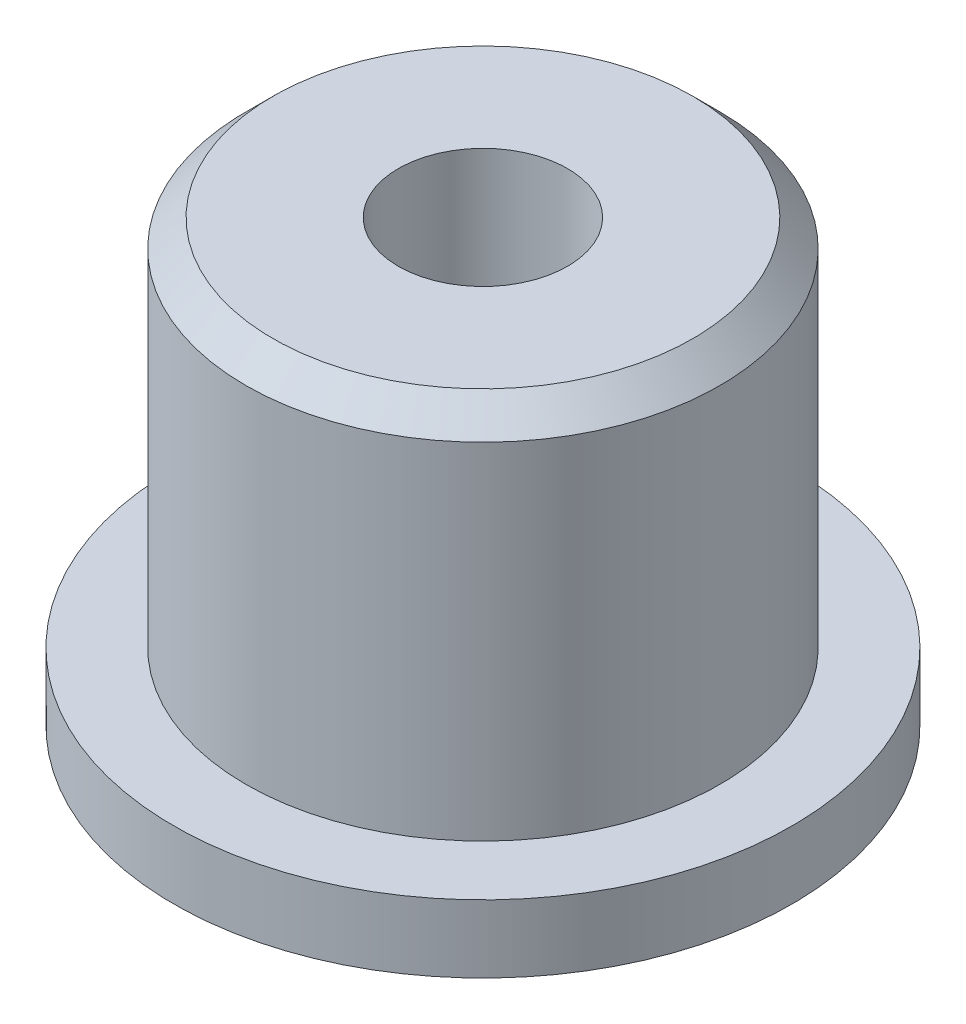
ISO-10303-21;
HEADER;
FILE_DESCRIPTION(('STEP AP214'),'2;1');
FILE_NAME('part.step','',(''),(''),'','','');
FILE_SCHEMA(('AUTOMOTIVE_DESIGN { 1 0 10303 214 1 1 1 1 }'));
ENDSEC;
DATA;
#1=APPLICATION_CONTEXT('core data for automotive mechanical design processes');
#2=APPLICATION_PROTOCOL_DEFINITION('international standard','automotive_design',2000,#1);
#3=PRODUCT_CONTEXT('',#1,'mechanical');
#4=PRODUCT('Part','Part','',(#3));
#5=PRODUCT_RELATED_PRODUCT_CATEGORY('part','',(#4));
#6=PRODUCT_DEFINITION_FORMATION('','',#4);
#7=PRODUCT_DEFINITION_CONTEXT('part definition',#1,'design');
#8=PRODUCT_DEFINITION('design','',#6,#7);
#9=PRODUCT_DEFINITION_SHAPE('','',#8);
#10=(LENGTH_UNIT() NAMED_UNIT(*) SI_UNIT(.MILLI.,.METRE.));
#11=(NAMED_UNIT(*) PLANE_ANGLE_UNIT() SI_UNIT($,.RADIAN.));
#12=(NAMED_UNIT(*) SI_UNIT($,.STERADIAN.) SOLID_ANGLE_UNIT());
#13=UNCERTAINTY_MEASURE_WITH_UNIT(LENGTH_MEASURE(1.E-05),#10,'distance_accuracy_value','');
#14=(GEOMETRIC_REPRESENTATION_CONTEXT(3) GLOBAL_UNCERTAINTY_ASSIGNED_CONTEXT((#13)) GLOBAL_UNIT_ASSIGNED_CONTEXT((#10,
#11,#12)) REPRESENTATION_CONTEXT('',''));
#15=CARTESIAN_POINT('',(0.,0.,0.));
#16=DIRECTION('',(0.,0.,1.));
#17=DIRECTION('',(1.,0.,0.));
#18=AXIS2_PLACEMENT_3D('',#15,#16,#17);
#19=CARTESIAN_POINT('',(0.,4.,0.));
#20=DIRECTION('',(0.,1.,0.));
#21=DIRECTION('',(0.,0.,1.));
#22=AXIS2_PLACEMENT_3D('',#19,#20,#21);
#23=CYLINDRICAL_SURFACE('',#22,14.);
#24=CARTESIAN_POINT('',(0.,4.,0.));
#25=DIRECTION('',(0.,1.,0.));
#26=DIRECTION('',(0.,0.,1.));
#27=AXIS2_PLACEMENT_3D('',#24,#25,#26);
#28=CIRCLE('',#27,14.);
#29=CARTESIAN_POINT('',(0.,4.,14.));
#30=VERTEX_POINT('',#29);
#31=EDGE_CURVE('E42',#30,#30,#28,.T.);
#32=ORIENTED_EDGE('',*,*,#31,.T.);
#33=EDGE_LOOP('',(#32));
#34=FACE_BOUND('',#33,.T.);
#35=CARTESIAN_POINT('',(0.,24.4,0.));
#36=DIRECTION('',(0.,-1.,0.));
#37=DIRECTION('',(0.,0.,-1.));
#38=AXIS2_PLACEMENT_3D('',#35,#36,#37);
#39=CIRCLE('',#38,13.9999999999999);
#40=CARTESIAN_POINT('',(0.,24.4,-13.9999999999998));
#41=VERTEX_POINT('',#40);
#42=EDGE_CURVE('E52',#41,#41,#39,.T.);
#43=ORIENTED_EDGE('',*,*,#42,.T.);
#44=EDGE_LOOP('',(#43));
#45=FACE_BOUND('',#44,.T.);
#46=ADVANCED_FACE('F31',(#34,#45),#23,.T.);
#47=CARTESIAN_POINT('',(0.,26.,0.));
#48=DIRECTION('',(0.,1.,0.));
#49=DIRECTION('',(0.,0.,1.));
#50=AXIS2_PLACEMENT_3D('',#47,#48,#49);
#51=PLANE('',#50);
#52=CARTESIAN_POINT('',(0.,26.,0.));
#53=DIRECTION('',(0.,1.,0.));
#54=DIRECTION('',(0.,0.,1.));
#55=AXIS2_PLACEMENT_3D('',#52,#53,#54);
#56=CIRCLE('',#55,5.);
#57=CARTESIAN_POINT('',(0.,26.,5.));
#58=VERTEX_POINT('',#57);
#59=EDGE_CURVE('E49',#58,#58,#56,.T.);
#60=ORIENTED_EDGE('',*,*,#59,.F.);
#61=EDGE_LOOP('',(#60));
#62=FACE_BOUND('',#61,.T.);
#63=CARTESIAN_POINT('',(0.,26.,0.));
#64=DIRECTION('',(0.,-1.,0.));
#65=DIRECTION('',(0.,0.,-1.));
#66=AXIS2_PLACEMENT_3D('',#63,#64,#65);
#67=CIRCLE('',#66,12.3999999999999);
#68=CARTESIAN_POINT('',(0.,26.0000000000001,-12.3999999999998));
#69=VERTEX_POINT('',#68);
#70=EDGE_CURVE('E57',#69,#69,#67,.T.);
#71=ORIENTED_EDGE('',*,*,#70,.F.);
#72=EDGE_LOOP('',(#71));
#73=FACE_BOUND('',#72,.T.);
#74=ADVANCED_FACE('F64',(#62,#73),#51,.T.);
#75=CARTESIAN_POINT('',(0.,26.,0.));
#76=DIRECTION('',(0.,-1.,0.));
#77=DIRECTION('',(0.,0.,-1.));
#78=AXIS2_PLACEMENT_3D('',#75,#76,#77);
#79=CYLINDRICAL_SURFACE('',#78,18.25);
#80=CARTESIAN_POINT('',(0.,0.,0.));
#81=DIRECTION('',(0.,1.,0.));
#82=DIRECTION('',(0.,0.,1.));
#83=AXIS2_PLACEMENT_3D('',#80,#81,#82);
#84=CIRCLE('',#83,18.25);
#85=CARTESIAN_POINT('',(0.,0.,-18.25));
#86=VERTEX_POINT('',#85);
#87=EDGE_CURVE('E10',#86,#86,#84,.T.);
#88=CARTESIAN_POINT('',(0.,4.,0.));
#89=DIRECTION('',(0.,1.,0.));
#90=DIRECTION('',(0.,0.,1.));
#91=AXIS2_PLACEMENT_3D('',#88,#89,#90);
#92=CIRCLE('',#91,18.25);
#93=CARTESIAN_POINT('',(0.,4.,-18.25));
#94=VERTEX_POINT('',#93);
#95=EDGE_CURVE('E38',#94,#94,#92,.T.);
#96=CARTESIAN_POINT('',(0.,0.,-18.25));
#97=CARTESIAN_POINT('',(0.,0.0416666666666667,-18.25));
#98=CARTESIAN_POINT('',(0.,0.0833333333333334,-18.25));
#99=CARTESIAN_POINT('',(0.,0.166666666666667,-18.25));
#100=CARTESIAN_POINT('',(0.,0.208333333333334,-18.25));
#101=CARTESIAN_POINT('',(0.,0.291666666666667,-18.25));
#102=CARTESIAN_POINT('',(0.,0.333333333333334,-18.25));
#103=CARTESIAN_POINT('',(0.,0.416666666666667,-18.25));
#104=CARTESIAN_POINT('',(0.,0.458333333333334,-18.25));
#105=CARTESIAN_POINT('',(0.,0.541666666666667,-18.25));
#106=CARTESIAN_POINT('',(0.,0.583333333333334,-18.25));
#107=CARTESIAN_POINT('',(0.,0.666666666666667,-18.25));
#108=CARTESIAN_POINT('',(0.,0.708333333333334,-18.25));
#109=CARTESIAN_POINT('',(0.,0.791666666666667,-18.25));
#110=CARTESIAN_POINT('',(0.,0.833333333333334,-18.25));
#111=CARTESIAN_POINT('',(0.,0.916666666666668,-18.25));
#112=CARTESIAN_POINT('',(0.,0.958333333333334,-18.25));
#113=CARTESIAN_POINT('',(0.,1.04166666666667,-18.25));
#114=CARTESIAN_POINT('',(0.,1.08333333333333,-18.25));
#115=CARTESIAN_POINT('',(0.,1.16666666666666,-18.25));
#116=CARTESIAN_POINT('',(0.,1.20833333333333,-18.25));
#117=CARTESIAN_POINT('',(0.,1.29166666666666,-18.25));
#118=CARTESIAN_POINT('',(0.,1.33333333333333,-18.25));
#119=CARTESIAN_POINT('',(0.,1.41666666666666,-18.25));
#120=CARTESIAN_POINT('',(0.,1.45833333333333,-18.25));
#121=CARTESIAN_POINT('',(0.,1.54166666666666,-18.25));
#122=CARTESIAN_POINT('',(0.,1.58333333333333,-18.25));
#123=CARTESIAN_POINT('',(0.,1.66666666666666,-18.25));
#124=CARTESIAN_POINT('',(0.,1.70833333333333,-18.25));
#125=CARTESIAN_POINT('',(0.,1.79166666666666,-18.25));
#126=CARTESIAN_POINT('',(0.,1.83333333333333,-18.25));
#127=CARTESIAN_POINT('',(0.,1.91666666666666,-18.25));
#128=CARTESIAN_POINT('',(0.,1.95833333333333,-18.25));
#129=CARTESIAN_POINT('',(0.,2.04166666666667,-18.25));
#130=CARTESIAN_POINT('',(0.,2.08333333333333,-18.25));
#131=CARTESIAN_POINT('',(0.,2.16666666666667,-18.25));
#132=CARTESIAN_POINT('',(0.,2.20833333333333,-18.25));
#133=CARTESIAN_POINT('',(0.,2.29166666666667,-18.25));
#134=CARTESIAN_POINT('',(0.,2.33333333333333,-18.25));
#135=CARTESIAN_POINT('',(0.,2.41666666666667,-18.25));
#136=CARTESIAN_POINT('',(0.,2.45833333333333,-18.25));
#137=CARTESIAN_POINT('',(0.,2.54166666666667,-18.25));
#138=CARTESIAN_POINT('',(0.,2.58333333333333,-18.25));
#139=CARTESIAN_POINT('',(0.,2.66666666666667,-18.25));
#140=CARTESIAN_POINT('',(0.,2.70833333333333,-18.25));
#141=CARTESIAN_POINT('',(0.,2.79166666666666,-18.25));
#142=CARTESIAN_POINT('',(0.,2.83333333333333,-18.25));
#143=CARTESIAN_POINT('',(0.,2.91666666666666,-18.25));
#144=CARTESIAN_POINT('',(0.,2.95833333333333,-18.25));
#145=CARTESIAN_POINT('',(0.,3.04166666666666,-18.25));
#146=CARTESIAN_POINT('',(0.,3.08333333333333,-18.25));
#147=CARTESIAN_POINT('',(0.,3.16666666666666,-18.25));
#148=CARTESIAN_POINT('',(0.,3.20833333333333,-18.25));
#149=CARTESIAN_POINT('',(0.,3.29166666666666,-18.25));
#150=CARTESIAN_POINT('',(0.,3.33333333333333,-18.25));
#151=CARTESIAN_POINT('',(0.,3.41666666666666,-18.25));
#152=CARTESIAN_POINT('',(0.,3.45833333333333,-18.25));
#153=CARTESIAN_POINT('',(0.,3.54166666666666,-18.25));
#154=CARTESIAN_POINT('',(0.,3.58333333333333,-18.25));
#155=CARTESIAN_POINT('',(0.,3.66666666666666,-18.25));
#156=CARTESIAN_POINT('',(0.,3.70833333333333,-18.25));
#157=CARTESIAN_POINT('',(0.,3.79166666666666,-18.25));
#158=CARTESIAN_POINT('',(0.,3.83333333333333,-18.25));
#159=CARTESIAN_POINT('',(0.,3.91666666666666,-18.25));
#160=CARTESIAN_POINT('',(0.,3.95833333333333,-18.25));
#161=CARTESIAN_POINT('',(0.,4.,-18.25));
#162=B_SPLINE_CURVE_WITH_KNOTS('',3,(#96,#97,#98,#99,#100,#101,#102,#103,#104,#105,#106,#107,
#108,#109,#110,#111,#112,#113,#114,#115,#116,#117,#118,#119,#120,#121,#122,#123,#124,#125,#126,
#127,#128,#129,#130,#131,#132,#133,#134,#135,#136,#137,#138,#139,#140,#141,#142,#143,#144,#145,
#146,#147,#148,#149,#150,#151,#152,#153,#154,#155,#156,#157,#158,#159,#160,#161),.UNSPECIFIED.,
.F.,.F.,(4,2,2,2,2,2,2,2,2,2,2,2,2,2,2,2,2,2,2,2,2,2,2,2,2,2,2,2,2,2,2,2,4),(0.,0.125,0.25,
0.375,0.5,0.625000000000001,0.750000000000001,0.875000000000001,1.,1.125,1.25,1.375,1.5,1.625,
1.75,1.875,2.,2.125,2.25,2.375,2.5,2.625,2.75,2.875,3.,3.125,3.25,3.375,3.5,3.625,3.75,3.875,
4.),.UNSPECIFIED.);
#163=EDGE_CURVE('BSEAM33',#86,#94,#162,.T.);
#164=ORIENTED_EDGE('',*,*,#87,.T.);
#165=ORIENTED_EDGE('',*,*,#95,.F.);
#166=ORIENTED_EDGE('',*,*,#163,.T.);
#167=ORIENTED_EDGE('',*,*,#163,.F.);
#168=EDGE_LOOP('',(#164,#166,#165,#167));
#169=FACE_BOUND('',#168,.T.);
#170=ADVANCED_FACE('F33',(#169),#79,.T.);
#171=CARTESIAN_POINT('',(0.,0.,0.));
#172=DIRECTION('',(0.,1.,0.));
#173=DIRECTION('',(0.,0.,1.));
#174=AXIS2_PLACEMENT_3D('',#171,#172,#173);
#175=PLANE('',#174);
#176=CARTESIAN_POINT('',(0.,0.,0.));
#177=DIRECTION('',(0.,1.,0.));
#178=DIRECTION('',(0.,0.,1.));
#179=AXIS2_PLACEMENT_3D('',#176,#177,#178);
#180=CIRCLE('',#179,5.);
#181=CARTESIAN_POINT('',(0.,0.,5.));
#182=VERTEX_POINT('',#181);
#183=EDGE_CURVE('E46',#182,#182,#180,.T.);
#184=ORIENTED_EDGE('',*,*,#183,.T.);
#185=EDGE_LOOP('',(#184));
#186=FACE_BOUND('',#185,.T.);
#187=ORIENTED_EDGE('',*,*,#87,.F.);
#188=EDGE_LOOP('',(#187));
#189=FACE_BOUND('',#188,.T.);
#190=ADVANCED_FACE('F72',(#186,#189),#175,.F.);
#191=CARTESIAN_POINT('',(0.,4.,0.));
#192=DIRECTION('',(0.,1.,0.));
#193=DIRECTION('',(0.,0.,1.));
#194=AXIS2_PLACEMENT_3D('',#191,#192,#193);
#195=PLANE('',#194);
#196=ORIENTED_EDGE('',*,*,#31,.F.);
#197=EDGE_LOOP('',(#196));
#198=FACE_BOUND('',#197,.T.);
#199=ORIENTED_EDGE('',*,*,#95,.T.);
#200=EDGE_LOOP('',(#199));
#201=FACE_BOUND('',#200,.T.);
#202=ADVANCED_FACE('F77',(#198,#201),#195,.T.);
#203=CARTESIAN_POINT('',(0.,0.,0.));
#204=DIRECTION('',(0.,1.,0.));
#205=DIRECTION('',(0.,0.,1.));
#206=AXIS2_PLACEMENT_3D('',#203,#204,#205);
#207=CYLINDRICAL_SURFACE('',#206,5.);
#208=CARTESIAN_POINT('',(0.,0.,5.));
#209=CARTESIAN_POINT('',(0.,0.270833333333333,5.));
#210=CARTESIAN_POINT('',(0.,0.541666666666667,5.));
#211=CARTESIAN_POINT('',(0.,1.08333333333333,5.));
#212=CARTESIAN_POINT('',(0.,1.35416666666667,5.));
#213=CARTESIAN_POINT('',(0.,1.89583333333333,5.));
#214=CARTESIAN_POINT('',(0.,2.16666666666667,5.));
#215=CARTESIAN_POINT('',(0.,2.70833333333333,5.));
#216=CARTESIAN_POINT('',(0.,2.97916666666667,5.));
#217=CARTESIAN_POINT('',(0.,3.52083333333333,5.));
#218=CARTESIAN_POINT('',(0.,3.79166666666667,5.));
#219=CARTESIAN_POINT('',(0.,4.33333333333333,5.));
#220=CARTESIAN_POINT('',(0.,4.60416666666667,5.));
#221=CARTESIAN_POINT('',(0.,5.14583333333333,5.));
#222=CARTESIAN_POINT('',(0.,5.41666666666667,5.));
#223=CARTESIAN_POINT('',(0.,5.95833333333333,5.));
#224=CARTESIAN_POINT('',(0.,6.22916666666667,5.));
#225=CARTESIAN_POINT('',(0.,6.77083333333333,5.));
#226=CARTESIAN_POINT('',(0.,7.04166666666667,5.));
#227=CARTESIAN_POINT('',(0.,7.58333333333333,5.));
#228=CARTESIAN_POINT('',(0.,7.85416666666667,5.));
#229=CARTESIAN_POINT('',(0.,8.39583333333333,5.));
#230=CARTESIAN_POINT('',(0.,8.66666666666667,5.));
#231=CARTESIAN_POINT('',(0.,9.20833333333333,5.));
#232=CARTESIAN_POINT('',(0.,9.47916666666667,5.));
#233=CARTESIAN_POINT('',(0.,10.0208333333333,5.));
#234=CARTESIAN_POINT('',(0.,10.2916666666667,5.));
#235=CARTESIAN_POINT('',(0.,10.8333333333333,5.));
#236=CARTESIAN_POINT('',(0.,11.1041666666667,5.));
#237=CARTESIAN_POINT('',(0.,11.6458333333333,5.));
#238=CARTESIAN_POINT('',(0.,11.9166666666667,5.));
#239=CARTESIAN_POINT('',(0.,12.4583333333333,5.));
#240=CARTESIAN_POINT('',(0.,12.7291666666667,5.));
#241=CARTESIAN_POINT('',(0.,13.2708333333333,5.));
#242=CARTESIAN_POINT('',(0.,13.5416666666667,5.));
#243=CARTESIAN_POINT('',(0.,14.0833333333333,5.));
#244=CARTESIAN_POINT('',(0.,14.3541666666667,5.));
#245=CARTESIAN_POINT('',(0.,14.8958333333333,5.));
#246=CARTESIAN_POINT('',(0.,15.1666666666667,5.));
#247=CARTESIAN_POINT('',(0.,15.7083333333333,5.));
#248=CARTESIAN_POINT('',(0.,15.9791666666667,5.));
#249=CARTESIAN_POINT('',(0.,16.5208333333333,5.));
#250=CARTESIAN_POINT('',(0.,16.7916666666667,5.));
#251=CARTESIAN_POINT('',(0.,17.3333333333333,5.));
#252=CARTESIAN_POINT('',(0.,17.6041666666667,5.));
#253=CARTESIAN_POINT('',(0.,18.1458333333333,5.));
#254=CARTESIAN_POINT('',(0.,18.4166666666667,5.));
#255=CARTESIAN_POINT('',(0.,18.9583333333333,5.));
#256=CARTESIAN_POINT('',(0.,19.2291666666667,5.));
#257=CARTESIAN_POINT('',(0.,19.7708333333333,5.));
#258=CARTESIAN_POINT('',(0.,20.0416666666667,5.));
#259=CARTESIAN_POINT('',(0.,20.5833333333333,5.));
#260=CARTESIAN_POINT('',(0.,20.8541666666667,5.));
#261=CARTESIAN_POINT('',(0.,21.3958333333333,5.));
#262=CARTESIAN_POINT('',(0.,21.6666666666667,5.));
#263=CARTESIAN_POINT('',(0.,22.2083333333333,5.));
#264=CARTESIAN_POINT('',(0.,22.4791666666667,5.));
#265=CARTESIAN_POINT('',(0.,23.0208333333333,5.));
#266=CARTESIAN_POINT('',(0.,23.2916666666667,5.));
#267=CARTESIAN_POINT('',(0.,23.8333333333333,5.));
#268=CARTESIAN_POINT('',(0.,24.1041666666667,5.));
#269=CARTESIAN_POINT('',(0.,24.6458333333333,5.));
#270=CARTESIAN_POINT('',(0.,24.9166666666667,5.));
#271=CARTESIAN_POINT('',(0.,25.4583333333333,5.));
#272=CARTESIAN_POINT('',(0.,25.7291666666667,5.));
#273=CARTESIAN_POINT('',(0.,26.,5.));
#274=B_SPLINE_CURVE_WITH_KNOTS('',3,(#208,#209,#210,#211,#212,#213,#214,#215,#216,#217,#218,
#219,#220,#221,#222,#223,#224,#225,#226,#227,#228,#229,#230,#231,#232,#233,#234,#235,#236,#237,
#238,#239,#240,#241,#242,#243,#244,#245,#246,#247,#248,#249,#250,#251,#252,#253,#254,#255,#256,
#257,#258,#259,#260,#261,#262,#263,#264,#265,#266,#267,#268,#269,#270,#271,#272,#273),
.UNSPECIFIED.,.F.,.F.,(4,2,2,2,2,2,2,2,2,2,2,2,2,2,2,2,2,2,2,2,2,2,2,2,2,2,2,2,2,2,2,2,4),(0.,
0.8125,1.625,2.4375,3.25,4.0625,4.875,5.6875,6.5,7.3125,8.125,8.9375,9.75,10.5625,11.375,
12.1875,13.,13.8125,14.625,15.4375,16.25,17.0625,17.875,18.6875,19.5,20.3125,21.125,21.9375,
22.75,23.5625,24.375,25.1875,26.),.UNSPECIFIED.);
#275=EDGE_CURVE('BSEAM83',#182,#58,#274,.T.);
#276=ORIENTED_EDGE('',*,*,#183,.F.);
#277=ORIENTED_EDGE('',*,*,#59,.T.);
#278=ORIENTED_EDGE('',*,*,#275,.T.);
#279=ORIENTED_EDGE('',*,*,#275,.F.);
#280=EDGE_LOOP('',(#276,#278,#277,#279));
#281=FACE_BOUND('',#280,.T.);
#282=ADVANCED_FACE('F83',(#281),#207,.F.);
#283=CARTESIAN_POINT('',(0.,24.4,0.));
#284=DIRECTION('',(0.,-1.,0.));
#285=DIRECTION('',(0.,0.,-1.));
#286=AXIS2_PLACEMENT_3D('',#283,#284,#285);
#287=CONICAL_SURFACE('',#286,13.9999999999999,0.785398163397436);
#288=ORIENTED_EDGE('',*,*,#70,.T.);
#289=EDGE_LOOP('',(#288));
#290=FACE_BOUND('',#289,.T.);
#291=ORIENTED_EDGE('',*,*,#42,.F.);
#292=EDGE_LOOP('',(#291));
#293=FACE_BOUND('',#292,.T.);
#294=ADVANCED_FACE('F61',(#290,#293),#287,.T.);
#295=CLOSED_SHELL('',(#46,#74,#170,#190,#202,#282,#294));
#296=MANIFOLD_SOLID_BREP('B2',#295);
#297=ADVANCED_BREP_SHAPE_REPRESENTATION('',(#18,#296),#14);
#298=SHAPE_DEFINITION_REPRESENTATION(#9,#297);
ENDSEC;
END-ISO-10303-21;
